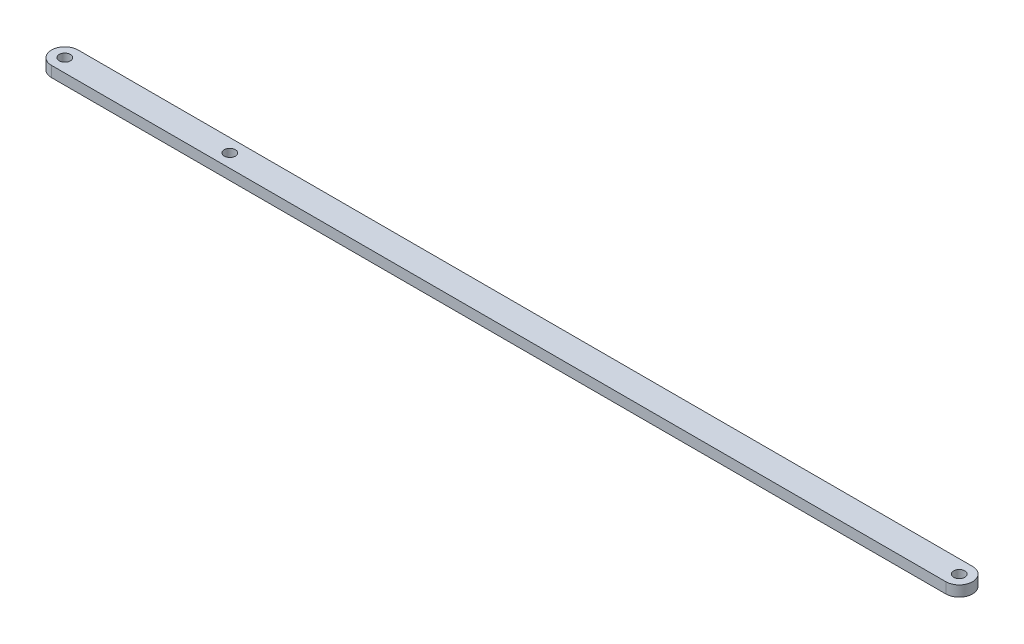
ISO-10303-21;
HEADER;
FILE_DESCRIPTION(('STEP AP214'),'2;1');
FILE_NAME('part.step','',(''),(''),'','','');
FILE_SCHEMA(('AUTOMOTIVE_DESIGN { 1 0 10303 214 1 1 1 1 }'));
ENDSEC;
DATA;
#1=APPLICATION_CONTEXT('core data for automotive mechanical design processes');
#2=APPLICATION_PROTOCOL_DEFINITION('international standard','automotive_design',2000,#1);
#3=PRODUCT_CONTEXT('',#1,'mechanical');
#4=PRODUCT('Part','Part','',(#3));
#5=PRODUCT_RELATED_PRODUCT_CATEGORY('part','',(#4));
#6=PRODUCT_DEFINITION_FORMATION('','',#4);
#7=PRODUCT_DEFINITION_CONTEXT('part definition',#1,'design');
#8=PRODUCT_DEFINITION('design','',#6,#7);
#9=PRODUCT_DEFINITION_SHAPE('','',#8);
#10=(LENGTH_UNIT() NAMED_UNIT(*) SI_UNIT(.MILLI.,.METRE.));
#11=(NAMED_UNIT(*) PLANE_ANGLE_UNIT() SI_UNIT($,.RADIAN.));
#12=(NAMED_UNIT(*) SI_UNIT($,.STERADIAN.) SOLID_ANGLE_UNIT());
#13=UNCERTAINTY_MEASURE_WITH_UNIT(LENGTH_MEASURE(1.E-05),#10,'distance_accuracy_value','');
#14=(GEOMETRIC_REPRESENTATION_CONTEXT(3) GLOBAL_UNCERTAINTY_ASSIGNED_CONTEXT((#13)) GLOBAL_UNIT_ASSIGNED_CONTEXT((#10,
#11,#12)) REPRESENTATION_CONTEXT('',''));
#15=CARTESIAN_POINT('',(0.,0.,0.));
#16=DIRECTION('',(0.,0.,1.));
#17=DIRECTION('',(1.,0.,0.));
#18=AXIS2_PLACEMENT_3D('',#15,#16,#17);
#19=CARTESIAN_POINT('',(0.,2.,0.));
#20=DIRECTION('',(0.,1.,0.));
#21=DIRECTION('',(0.,0.,1.));
#22=AXIS2_PLACEMENT_3D('',#19,#20,#21);
#23=PLANE('',#22);
#24=CARTESIAN_POINT('',(168.,2.,0.));
#25=DIRECTION('',(0.,1.,0.));
#26=DIRECTION('',(0.,0.,1.));
#27=AXIS2_PLACEMENT_3D('',#24,#25,#26);
#28=CIRCLE('',#27,1.04999999999999);
#29=CARTESIAN_POINT('',(168.,2.,1.04999999999999));
#30=VERTEX_POINT('',#29);
#31=EDGE_CURVE('E121',#30,#30,#28,.T.);
#32=ORIENTED_EDGE('',*,*,#31,.F.);
#33=EDGE_LOOP('',(#32));
#34=FACE_BOUND('',#33,.T.);
#35=CARTESIAN_POINT('',(0.,2.,0.));
#36=DIRECTION('',(0.,1.,0.));
#37=DIRECTION('',(0.,0.,1.));
#38=AXIS2_PLACEMENT_3D('',#35,#36,#37);
#39=CIRCLE('',#38,2.5);
#40=CARTESIAN_POINT('',(0.,2.,-2.5));
#41=VERTEX_POINT('',#40);
#42=CARTESIAN_POINT('',(0.,2.,2.5));
#43=VERTEX_POINT('',#42);
#44=EDGE_CURVE('E91',#41,#43,#39,.T.);
#45=ORIENTED_EDGE('',*,*,#44,.T.);
#46=DIRECTION('',(1.,0.,0.));
#47=VECTOR('',#46,1.);
#48=CARTESIAN_POINT('',(0.,2.,2.5));
#49=LINE('',#48,#47);
#50=CARTESIAN_POINT('',(168.,2.,2.5));
#51=VERTEX_POINT('',#50);
#52=EDGE_CURVE('E86',#43,#51,#49,.T.);
#53=ORIENTED_EDGE('',*,*,#52,.T.);
#54=CARTESIAN_POINT('',(168.,2.,0.));
#55=DIRECTION('',(0.,1.,0.));
#56=DIRECTION('',(0.,0.,1.));
#57=AXIS2_PLACEMENT_3D('',#54,#55,#56);
#58=CIRCLE('',#57,2.5);
#59=CARTESIAN_POINT('',(168.,2.,-2.5));
#60=VERTEX_POINT('',#59);
#61=EDGE_CURVE('E89',#51,#60,#58,.T.);
#62=ORIENTED_EDGE('',*,*,#61,.T.);
#63=DIRECTION('',(-1.,0.,0.));
#64=VECTOR('',#63,1.);
#65=CARTESIAN_POINT('',(0.,2.,-2.5));
#66=LINE('',#65,#64);
#67=EDGE_CURVE('E56',#60,#41,#66,.T.);
#68=ORIENTED_EDGE('',*,*,#67,.T.);
#69=EDGE_LOOP('',(#45,#53,#62,#68));
#70=FACE_BOUND('',#69,.T.);
#71=CARTESIAN_POINT('',(0.,2.,0.));
#72=DIRECTION('',(0.,1.,0.));
#73=DIRECTION('',(0.,0.,1.));
#74=AXIS2_PLACEMENT_3D('',#71,#72,#73);
#75=CIRCLE('',#74,1.05);
#76=CARTESIAN_POINT('',(0.,2.,1.05));
#77=VERTEX_POINT('',#76);
#78=EDGE_CURVE('E106',#77,#77,#75,.T.);
#79=ORIENTED_EDGE('',*,*,#78,.F.);
#80=EDGE_LOOP('',(#79));
#81=FACE_BOUND('',#80,.T.);
#82=CARTESIAN_POINT('',(31.,2.,0.));
#83=DIRECTION('',(0.,1.,0.));
#84=DIRECTION('',(0.,0.,1.));
#85=AXIS2_PLACEMENT_3D('',#82,#83,#84);
#86=CIRCLE('',#85,1.04999999999999);
#87=CARTESIAN_POINT('',(31.,2.,1.04999999999999));
#88=VERTEX_POINT('',#87);
#89=EDGE_CURVE('E127',#88,#88,#86,.T.);
#90=ORIENTED_EDGE('',*,*,#89,.F.);
#91=EDGE_LOOP('',(#90));
#92=FACE_BOUND('',#91,.T.);
#93=ADVANCED_FACE('F39',(#34,#70,#81,#92),#23,.T.);
#94=CARTESIAN_POINT('',(0.,0.,0.));
#95=DIRECTION('',(0.,1.,0.));
#96=DIRECTION('',(0.,0.,1.));
#97=AXIS2_PLACEMENT_3D('',#94,#95,#96);
#98=PLANE('',#97);
#99=CARTESIAN_POINT('',(0.,0.,0.));
#100=DIRECTION('',(0.,1.,0.));
#101=DIRECTION('',(0.,0.,1.));
#102=AXIS2_PLACEMENT_3D('',#99,#100,#101);
#103=CIRCLE('',#102,2.5);
#104=CARTESIAN_POINT('',(0.,0.,-2.5));
#105=VERTEX_POINT('',#104);
#106=CARTESIAN_POINT('',(0.,0.,2.5));
#107=VERTEX_POINT('',#106);
#108=EDGE_CURVE('E103',#105,#107,#103,.T.);
#109=ORIENTED_EDGE('',*,*,#108,.F.);
#110=DIRECTION('',(-1.,0.,0.));
#111=VECTOR('',#110,1.);
#112=CARTESIAN_POINT('',(0.,0.,-2.5));
#113=LINE('',#112,#111);
#114=CARTESIAN_POINT('',(168.,0.,-2.5));
#115=VERTEX_POINT('',#114);
#116=EDGE_CURVE('E79',#115,#105,#113,.T.);
#117=ORIENTED_EDGE('',*,*,#116,.F.);
#118=CARTESIAN_POINT('',(168.,0.,0.));
#119=DIRECTION('',(0.,1.,0.));
#120=DIRECTION('',(0.,0.,1.));
#121=AXIS2_PLACEMENT_3D('',#118,#119,#120);
#122=CIRCLE('',#121,2.5);
#123=CARTESIAN_POINT('',(168.,0.,2.5));
#124=VERTEX_POINT('',#123);
#125=EDGE_CURVE('E73',#124,#115,#122,.T.);
#126=ORIENTED_EDGE('',*,*,#125,.F.);
#127=DIRECTION('',(1.,0.,0.));
#128=VECTOR('',#127,1.);
#129=CARTESIAN_POINT('',(0.,0.,2.5));
#130=LINE('',#129,#128);
#131=EDGE_CURVE('E95',#107,#124,#130,.T.);
#132=ORIENTED_EDGE('',*,*,#131,.F.);
#133=EDGE_LOOP('',(#109,#117,#126,#132));
#134=FACE_BOUND('',#133,.T.);
#135=CARTESIAN_POINT('',(0.,0.,0.));
#136=DIRECTION('',(0.,1.,0.));
#137=DIRECTION('',(0.,0.,1.));
#138=AXIS2_PLACEMENT_3D('',#135,#136,#137);
#139=CIRCLE('',#138,1.05);
#140=CARTESIAN_POINT('',(0.,0.,1.05));
#141=VERTEX_POINT('',#140);
#142=EDGE_CURVE('E118',#141,#141,#139,.T.);
#143=ORIENTED_EDGE('',*,*,#142,.T.);
#144=EDGE_LOOP('',(#143));
#145=FACE_BOUND('',#144,.T.);
#146=CARTESIAN_POINT('',(168.,0.,0.));
#147=DIRECTION('',(0.,1.,0.));
#148=DIRECTION('',(0.,0.,1.));
#149=AXIS2_PLACEMENT_3D('',#146,#147,#148);
#150=CIRCLE('',#149,1.04999999999999);
#151=CARTESIAN_POINT('',(168.,0.,1.04999999999999));
#152=VERTEX_POINT('',#151);
#153=EDGE_CURVE('E124',#152,#152,#150,.T.);
#154=ORIENTED_EDGE('',*,*,#153,.T.);
#155=EDGE_LOOP('',(#154));
#156=FACE_BOUND('',#155,.T.);
#157=CARTESIAN_POINT('',(31.,0.,0.));
#158=DIRECTION('',(0.,1.,0.));
#159=DIRECTION('',(0.,0.,1.));
#160=AXIS2_PLACEMENT_3D('',#157,#158,#159);
#161=CIRCLE('',#160,1.04999999999999);
#162=CARTESIAN_POINT('',(31.,0.,1.04999999999999));
#163=VERTEX_POINT('',#162);
#164=EDGE_CURVE('E130',#163,#163,#161,.T.);
#165=ORIENTED_EDGE('',*,*,#164,.T.);
#166=EDGE_LOOP('',(#165));
#167=FACE_BOUND('',#166,.T.);
#168=ADVANCED_FACE('F114',(#134,#145,#156,#167),#98,.F.);
#169=CARTESIAN_POINT('',(0.,2.,0.));
#170=DIRECTION('',(0.,-1.,0.));
#171=DIRECTION('',(0.,0.,-1.));
#172=AXIS2_PLACEMENT_3D('',#169,#170,#171);
#173=CYLINDRICAL_SURFACE('',#172,2.5);
#174=ORIENTED_EDGE('',*,*,#108,.T.);
#175=DIRECTION('',(0.,-1.,0.));
#176=VECTOR('',#175,1.);
#177=CARTESIAN_POINT('',(0.,2.,2.5));
#178=LINE('',#177,#176);
#179=EDGE_CURVE('E11',#43,#107,#178,.T.);
#180=ORIENTED_EDGE('',*,*,#179,.F.);
#181=ORIENTED_EDGE('',*,*,#44,.F.);
#182=DIRECTION('',(0.,-1.,0.));
#183=VECTOR('',#182,1.);
#184=CARTESIAN_POINT('',(0.,2.,-2.5));
#185=LINE('',#184,#183);
#186=EDGE_CURVE('E99',#41,#105,#185,.T.);
#187=ORIENTED_EDGE('',*,*,#186,.T.);
#188=EDGE_LOOP('',(#174,#180,#181,#187));
#189=FACE_BOUND('',#188,.T.);
#190=ADVANCED_FACE('F41',(#189),#173,.T.);
#191=CARTESIAN_POINT('',(0.,2.,2.5));
#192=DIRECTION('',(0.,0.,-1.));
#193=DIRECTION('',(-1.,0.,0.));
#194=AXIS2_PLACEMENT_3D('',#191,#192,#193);
#195=PLANE('',#194);
#196=ORIENTED_EDGE('',*,*,#131,.T.);
#197=DIRECTION('',(0.,-1.,0.));
#198=VECTOR('',#197,1.);
#199=CARTESIAN_POINT('',(168.,2.,2.5));
#200=LINE('',#199,#198);
#201=EDGE_CURVE('E48',#51,#124,#200,.T.);
#202=ORIENTED_EDGE('',*,*,#201,.F.);
#203=ORIENTED_EDGE('',*,*,#52,.F.);
#204=ORIENTED_EDGE('',*,*,#179,.T.);
#205=EDGE_LOOP('',(#196,#202,#203,#204));
#206=FACE_BOUND('',#205,.T.);
#207=ADVANCED_FACE('F94',(#206),#195,.F.);
#208=CARTESIAN_POINT('',(168.,2.,0.));
#209=DIRECTION('',(0.,-1.,0.));
#210=DIRECTION('',(0.,0.,-1.));
#211=AXIS2_PLACEMENT_3D('',#208,#209,#210);
#212=CYLINDRICAL_SURFACE('',#211,2.5);
#213=ORIENTED_EDGE('',*,*,#125,.T.);
#214=DIRECTION('',(0.,-1.,0.));
#215=VECTOR('',#214,1.);
#216=CARTESIAN_POINT('',(168.,2.,-2.5));
#217=LINE('',#216,#215);
#218=EDGE_CURVE('E96',#60,#115,#217,.T.);
#219=ORIENTED_EDGE('',*,*,#218,.F.);
#220=ORIENTED_EDGE('',*,*,#61,.F.);
#221=ORIENTED_EDGE('',*,*,#201,.T.);
#222=EDGE_LOOP('',(#213,#219,#220,#221));
#223=FACE_BOUND('',#222,.T.);
#224=ADVANCED_FACE('F97',(#223),#212,.T.);
#225=CARTESIAN_POINT('',(0.,2.,-2.5));
#226=DIRECTION('',(0.,0.,1.));
#227=DIRECTION('',(1.,0.,0.));
#228=AXIS2_PLACEMENT_3D('',#225,#226,#227);
#229=PLANE('',#228);
#230=ORIENTED_EDGE('',*,*,#116,.T.);
#231=ORIENTED_EDGE('',*,*,#186,.F.);
#232=ORIENTED_EDGE('',*,*,#67,.F.);
#233=ORIENTED_EDGE('',*,*,#218,.T.);
#234=EDGE_LOOP('',(#230,#231,#232,#233));
#235=FACE_BOUND('',#234,.T.);
#236=ADVANCED_FACE('F111',(#235),#229,.F.);
#237=CARTESIAN_POINT('',(0.,2.,0.));
#238=DIRECTION('',(0.,-1.,0.));
#239=DIRECTION('',(0.,0.,-1.));
#240=AXIS2_PLACEMENT_3D('',#237,#238,#239);
#241=CYLINDRICAL_SURFACE('',#240,1.05);
#242=ORIENTED_EDGE('',*,*,#78,.T.);
#243=EDGE_LOOP('',(#242));
#244=FACE_BOUND('',#243,.T.);
#245=ORIENTED_EDGE('',*,*,#142,.F.);
#246=EDGE_LOOP('',(#245));
#247=FACE_BOUND('',#246,.T.);
#248=ADVANCED_FACE('F148',(#244,#247),#241,.F.);
#249=CARTESIAN_POINT('',(168.,2.,0.));
#250=DIRECTION('',(0.,-1.,0.));
#251=DIRECTION('',(0.,0.,-1.));
#252=AXIS2_PLACEMENT_3D('',#249,#250,#251);
#253=CYLINDRICAL_SURFACE('',#252,1.04999999999999);
#254=ORIENTED_EDGE('',*,*,#31,.T.);
#255=EDGE_LOOP('',(#254));
#256=FACE_BOUND('',#255,.T.);
#257=ORIENTED_EDGE('',*,*,#153,.F.);
#258=EDGE_LOOP('',(#257));
#259=FACE_BOUND('',#258,.T.);
#260=ADVANCED_FACE('F202',(#256,#259),#253,.F.);
#261=CARTESIAN_POINT('',(31.,2.,0.));
#262=DIRECTION('',(0.,-1.,0.));
#263=DIRECTION('',(0.,0.,-1.));
#264=AXIS2_PLACEMENT_3D('',#261,#262,#263);
#265=CYLINDRICAL_SURFACE('',#264,1.04999999999999);
#266=ORIENTED_EDGE('',*,*,#89,.T.);
#267=EDGE_LOOP('',(#266));
#268=FACE_BOUND('',#267,.T.);
#269=ORIENTED_EDGE('',*,*,#164,.F.);
#270=EDGE_LOOP('',(#269));
#271=FACE_BOUND('',#270,.T.);
#272=ADVANCED_FACE('F136',(#268,#271),#265,.F.);
#273=CLOSED_SHELL('',(#93,#168,#190,#207,#224,#236,#248,#260,#272));
#274=MANIFOLD_SOLID_BREP('B2',#273);
#275=ADVANCED_BREP_SHAPE_REPRESENTATION('',(#18,#274),#14);
#276=SHAPE_DEFINITION_REPRESENTATION(#9,#275);
ENDSEC;
END-ISO-10303-21;
